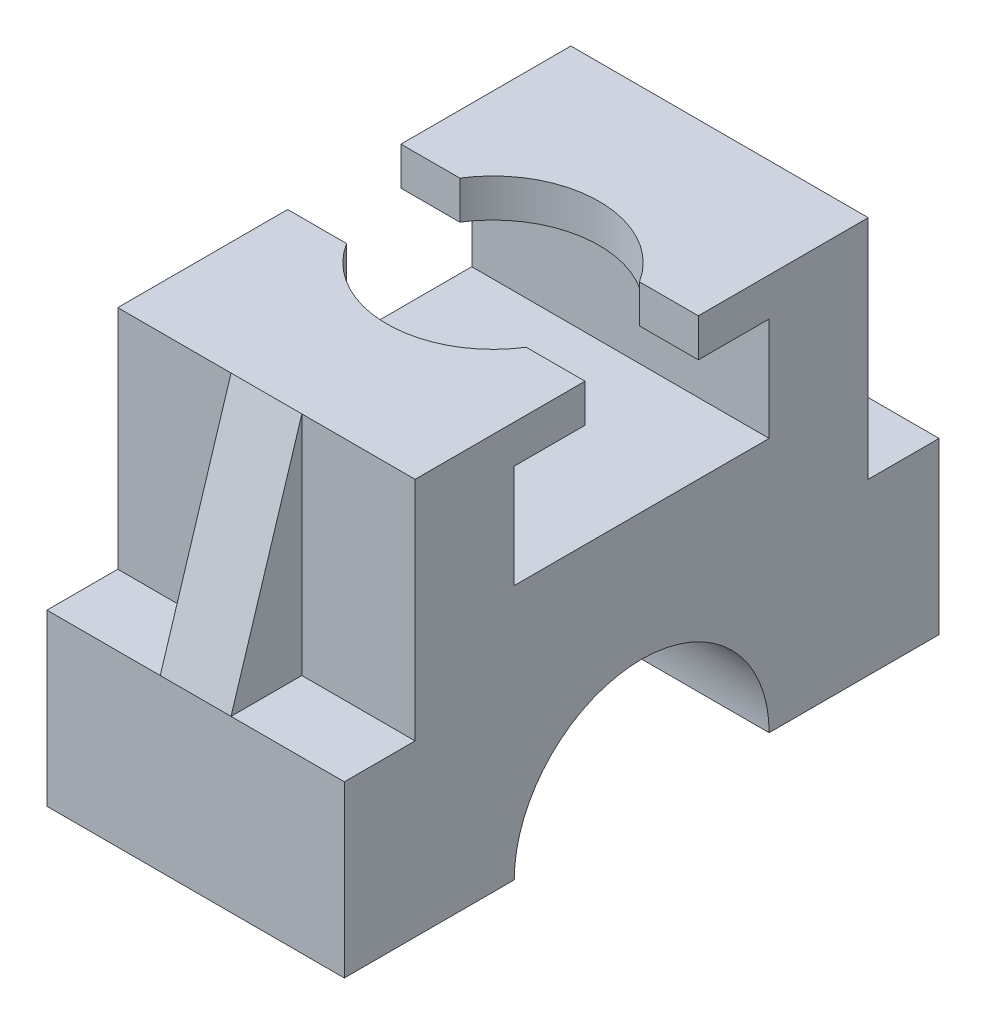
ISO-10303-21;
HEADER;
FILE_DESCRIPTION(('STEP AP214'),'2;1');
FILE_NAME('part.step','',(''),(''),'','','');
FILE_SCHEMA(('AUTOMOTIVE_DESIGN { 1 0 10303 214 1 1 1 1 }'));
ENDSEC;
DATA;
#1=APPLICATION_CONTEXT('core data for automotive mechanical design processes');
#2=APPLICATION_PROTOCOL_DEFINITION('international standard','automotive_design',2000,#1);
#3=PRODUCT_CONTEXT('',#1,'mechanical');
#4=PRODUCT('Part','Part','',(#3));
#5=PRODUCT_RELATED_PRODUCT_CATEGORY('part','',(#4));
#6=PRODUCT_DEFINITION_FORMATION('','',#4);
#7=PRODUCT_DEFINITION_CONTEXT('part definition',#1,'design');
#8=PRODUCT_DEFINITION('design','',#6,#7);
#9=PRODUCT_DEFINITION_SHAPE('','',#8);
#10=(LENGTH_UNIT() NAMED_UNIT(*) SI_UNIT(.MILLI.,.METRE.));
#11=(NAMED_UNIT(*) PLANE_ANGLE_UNIT() SI_UNIT($,.RADIAN.));
#12=(NAMED_UNIT(*) SI_UNIT($,.STERADIAN.) SOLID_ANGLE_UNIT());
#13=UNCERTAINTY_MEASURE_WITH_UNIT(LENGTH_MEASURE(1.E-05),#10,'distance_accuracy_value','');
#14=(GEOMETRIC_REPRESENTATION_CONTEXT(3) GLOBAL_UNCERTAINTY_ASSIGNED_CONTEXT((#13)) GLOBAL_UNIT_ASSIGNED_CONTEXT((#10,
#11,#12)) REPRESENTATION_CONTEXT('',''));
#15=CARTESIAN_POINT('',(0.,0.,0.));
#16=DIRECTION('',(0.,0.,1.));
#17=DIRECTION('',(1.,0.,0.));
#18=AXIS2_PLACEMENT_3D('',#15,#16,#17);
#19=CARTESIAN_POINT('',(52.5,140.,-20.));
#20=DIRECTION('',(0.,0.,-1.));
#21=DIRECTION('',(0.,1.,0.));
#22=AXIS2_PLACEMENT_3D('',#19,#20,#21);
#23=PLANE('',#22);
#24=DIRECTION('',(-1.,0.,0.));
#25=VECTOR('',#24,1.);
#26=CARTESIAN_POINT('',(52.5,126.521739130435,-20.));
#27=LINE('',#26,#25);
#28=CARTESIAN_POINT('',(-31.7214438511238,126.521739130435,-20.));
#29=VERTEX_POINT('',#28);
#30=CARTESIAN_POINT('',(-52.5,126.521739130435,-20.));
#31=VERTEX_POINT('',#30);
#32=EDGE_CURVE('E257',#29,#31,#27,.T.);
#33=ORIENTED_EDGE('',*,*,#32,.F.);
#34=DIRECTION('',(0.,1.,0.));
#35=VECTOR('',#34,1.);
#36=CARTESIAN_POINT('',(-31.7214438511238,109.,-20.));
#37=LINE('',#36,#35);
#38=CARTESIAN_POINT('',(-31.7214438511238,140.,-20.));
#39=VERTEX_POINT('',#38);
#40=EDGE_CURVE('E52',#29,#39,#37,.T.);
#41=ORIENTED_EDGE('',*,*,#40,.T.);
#42=DIRECTION('',(-1.,0.,0.));
#43=VECTOR('',#42,1.);
#44=CARTESIAN_POINT('',(52.5,140.,-20.));
#45=LINE('',#44,#43);
#46=CARTESIAN_POINT('',(-52.5,140.,-20.));
#47=VERTEX_POINT('',#46);
#48=EDGE_CURVE('E261',#39,#47,#45,.T.);
#49=ORIENTED_EDGE('',*,*,#48,.T.);
#50=DIRECTION('',(0.,-1.,0.));
#51=VECTOR('',#50,1.);
#52=CARTESIAN_POINT('',(-52.5,140.,-20.));
#53=LINE('',#52,#51);
#54=EDGE_CURVE('E323',#47,#31,#53,.T.);
#55=ORIENTED_EDGE('',*,*,#54,.T.);
#56=EDGE_LOOP('',(#33,#41,#49,#55));
#57=FACE_BOUND('',#56,.T.);
#58=ADVANCED_FACE('F37',(#57),#23,.F.);
#59=CARTESIAN_POINT('',(52.5,140.,20.));
#60=DIRECTION('',(0.,0.,1.));
#61=DIRECTION('',(0.,-1.,0.));
#62=AXIS2_PLACEMENT_3D('',#59,#60,#61);
#63=PLANE('',#62);
#64=DIRECTION('',(-1.,0.,0.));
#65=VECTOR('',#64,1.);
#66=CARTESIAN_POINT('',(52.5,126.521739130435,20.));
#67=LINE('',#66,#65);
#68=CARTESIAN_POINT('',(52.5,126.521739130435,20.));
#69=VERTEX_POINT('',#68);
#70=CARTESIAN_POINT('',(31.7214438511238,126.521739130435,20.));
#71=VERTEX_POINT('',#70);
#72=EDGE_CURVE('E236',#69,#71,#67,.T.);
#73=ORIENTED_EDGE('',*,*,#72,.T.);
#74=DIRECTION('',(0.,1.,0.));
#75=VECTOR('',#74,1.);
#76=CARTESIAN_POINT('',(31.7214438511238,109.,20.));
#77=LINE('',#76,#75);
#78=CARTESIAN_POINT('',(31.7214438511238,140.,20.));
#79=VERTEX_POINT('',#78);
#80=EDGE_CURVE('E221',#71,#79,#77,.T.);
#81=ORIENTED_EDGE('',*,*,#80,.T.);
#82=DIRECTION('',(-1.,0.,0.));
#83=VECTOR('',#82,1.);
#84=CARTESIAN_POINT('',(52.5,140.,20.));
#85=LINE('',#84,#83);
#86=CARTESIAN_POINT('',(52.5,140.,20.));
#87=VERTEX_POINT('',#86);
#88=EDGE_CURVE('E233',#87,#79,#85,.T.);
#89=ORIENTED_EDGE('',*,*,#88,.F.);
#90=DIRECTION('',(0.,1.,0.));
#91=VECTOR('',#90,1.);
#92=CARTESIAN_POINT('',(52.5,140.,20.));
#93=LINE('',#92,#91);
#94=EDGE_CURVE('E437',#69,#87,#93,.T.);
#95=ORIENTED_EDGE('',*,*,#94,.F.);
#96=EDGE_LOOP('',(#73,#81,#89,#95));
#97=FACE_BOUND('',#96,.T.);
#98=ADVANCED_FACE('F231',(#97),#63,.F.);
#99=CARTESIAN_POINT('',(52.5,60.,-105.));
#100=DIRECTION('',(0.,-1.,0.));
#101=DIRECTION('',(0.,0.,-1.));
#102=AXIS2_PLACEMENT_3D('',#99,#100,#101);
#103=PLANE('',#102);
#104=DIRECTION('',(0.,0.,1.));
#105=VECTOR('',#104,1.);
#106=CARTESIAN_POINT('',(-12.5,60.,-105.));
#107=LINE('',#106,#105);
#108=CARTESIAN_POINT('',(-12.5,60.,-105.));
#109=VERTEX_POINT('',#108);
#110=CARTESIAN_POINT('',(-12.5,60.,-80.));
#111=VERTEX_POINT('',#110);
#112=EDGE_CURVE('E506',#109,#111,#107,.T.);
#113=ORIENTED_EDGE('',*,*,#112,.F.);
#114=DIRECTION('',(-1.,0.,0.));
#115=VECTOR('',#114,1.);
#116=CARTESIAN_POINT('',(52.5,60.,-105.));
#117=LINE('',#116,#115);
#118=CARTESIAN_POINT('',(-52.5,60.,-105.));
#119=VERTEX_POINT('',#118);
#120=EDGE_CURVE('E274',#109,#119,#117,.T.);
#121=ORIENTED_EDGE('',*,*,#120,.T.);
#122=DIRECTION('',(0.,0.,1.));
#123=VECTOR('',#122,1.);
#124=CARTESIAN_POINT('',(-52.5,60.,-105.));
#125=LINE('',#124,#123);
#126=CARTESIAN_POINT('',(-52.5,60.,-80.));
#127=VERTEX_POINT('',#126);
#128=EDGE_CURVE('E314',#119,#127,#125,.T.);
#129=ORIENTED_EDGE('',*,*,#128,.T.);
#130=DIRECTION('',(-1.,0.,0.));
#131=VECTOR('',#130,1.);
#132=CARTESIAN_POINT('',(52.5,60.,-80.));
#133=LINE('',#132,#131);
#134=EDGE_CURVE('E269',#111,#127,#133,.T.);
#135=ORIENTED_EDGE('',*,*,#134,.F.);
#136=EDGE_LOOP('',(#113,#121,#129,#135));
#137=FACE_BOUND('',#136,.T.);
#138=ADVANCED_FACE('F464',(#137),#103,.F.);
#139=CARTESIAN_POINT('',(52.5,140.,-80.));
#140=DIRECTION('',(0.,0.,1.));
#141=DIRECTION('',(1.,0.,0.));
#142=AXIS2_PLACEMENT_3D('',#139,#140,#141);
#143=PLANE('',#142);
#144=DIRECTION('',(0.,1.,0.));
#145=VECTOR('',#144,1.);
#146=CARTESIAN_POINT('',(-12.5,140.,-80.));
#147=LINE('',#146,#145);
#148=CARTESIAN_POINT('',(-12.5,140.,-80.));
#149=VERTEX_POINT('',#148);
#150=EDGE_CURVE('E501',#111,#149,#147,.T.);
#151=ORIENTED_EDGE('',*,*,#150,.F.);
#152=ORIENTED_EDGE('',*,*,#134,.T.);
#153=DIRECTION('',(0.,1.,0.));
#154=VECTOR('',#153,1.);
#155=CARTESIAN_POINT('',(-52.5,140.,-80.));
#156=LINE('',#155,#154);
#157=CARTESIAN_POINT('',(-52.5,140.,-80.));
#158=VERTEX_POINT('',#157);
#159=EDGE_CURVE('E317',#127,#158,#156,.T.);
#160=ORIENTED_EDGE('',*,*,#159,.T.);
#161=DIRECTION('',(-1.,0.,0.));
#162=VECTOR('',#161,1.);
#163=CARTESIAN_POINT('',(52.5,140.,-80.));
#164=LINE('',#163,#162);
#165=EDGE_CURVE('E265',#149,#158,#164,.T.);
#166=ORIENTED_EDGE('',*,*,#165,.F.);
#167=EDGE_LOOP('',(#151,#152,#160,#166));
#168=FACE_BOUND('',#167,.T.);
#169=ADVANCED_FACE('F551',(#168),#143,.F.);
#170=CARTESIAN_POINT('',(52.5,140.,80.));
#171=DIRECTION('',(0.,0.,-1.));
#172=DIRECTION('',(-1.,0.,0.));
#173=AXIS2_PLACEMENT_3D('',#170,#171,#172);
#174=PLANE('',#173);
#175=DIRECTION('',(0.,-1.,0.));
#176=VECTOR('',#175,1.);
#177=CARTESIAN_POINT('',(-12.5,140.,80.));
#178=LINE('',#177,#176);
#179=CARTESIAN_POINT('',(-12.5,140.,80.));
#180=VERTEX_POINT('',#179);
#181=CARTESIAN_POINT('',(-12.5,60.,80.));
#182=VERTEX_POINT('',#181);
#183=EDGE_CURVE('E409',#180,#182,#178,.T.);
#184=ORIENTED_EDGE('',*,*,#183,.F.);
#185=DIRECTION('',(-1.,0.,0.));
#186=VECTOR('',#185,1.);
#187=CARTESIAN_POINT('',(52.5,140.,80.));
#188=LINE('',#187,#186);
#189=CARTESIAN_POINT('',(-52.5,140.,80.));
#190=VERTEX_POINT('',#189);
#191=EDGE_CURVE('E369',#180,#190,#188,.T.);
#192=ORIENTED_EDGE('',*,*,#191,.T.);
#193=DIRECTION('',(0.,-1.,0.));
#194=VECTOR('',#193,1.);
#195=CARTESIAN_POINT('',(-52.5,140.,80.));
#196=LINE('',#195,#194);
#197=CARTESIAN_POINT('',(-52.5,60.,80.));
#198=VERTEX_POINT('',#197);
#199=EDGE_CURVE('E347',#190,#198,#196,.T.);
#200=ORIENTED_EDGE('',*,*,#199,.T.);
#201=DIRECTION('',(-1.,0.,0.));
#202=VECTOR('',#201,1.);
#203=CARTESIAN_POINT('',(52.5,60.,80.));
#204=LINE('',#203,#202);
#205=EDGE_CURVE('E365',#182,#198,#204,.T.);
#206=ORIENTED_EDGE('',*,*,#205,.F.);
#207=EDGE_LOOP('',(#184,#192,#200,#206));
#208=FACE_BOUND('',#207,.T.);
#209=ADVANCED_FACE('F386',(#208),#174,.F.);
#210=CARTESIAN_POINT('',(52.5,60.,105.));
#211=DIRECTION('',(0.,-1.,0.));
#212=DIRECTION('',(0.,0.,-1.));
#213=AXIS2_PLACEMENT_3D('',#210,#211,#212);
#214=PLANE('',#213);
#215=DIRECTION('',(0.,0.,1.));
#216=VECTOR('',#215,1.);
#217=CARTESIAN_POINT('',(-12.5,60.,105.));
#218=LINE('',#217,#216);
#219=CARTESIAN_POINT('',(-12.5,60.,105.));
#220=VERTEX_POINT('',#219);
#221=EDGE_CURVE('E382',#182,#220,#218,.T.);
#222=ORIENTED_EDGE('',*,*,#221,.F.);
#223=ORIENTED_EDGE('',*,*,#205,.T.);
#224=DIRECTION('',(0.,0.,1.));
#225=VECTOR('',#224,1.);
#226=CARTESIAN_POINT('',(-52.5,60.,105.));
#227=LINE('',#226,#225);
#228=CARTESIAN_POINT('',(-52.5,60.,105.));
#229=VERTEX_POINT('',#228);
#230=EDGE_CURVE('E350',#198,#229,#227,.T.);
#231=ORIENTED_EDGE('',*,*,#230,.T.);
#232=DIRECTION('',(-1.,0.,0.));
#233=VECTOR('',#232,1.);
#234=CARTESIAN_POINT('',(52.5,60.,105.));
#235=LINE('',#234,#233);
#236=EDGE_CURVE('E362',#220,#229,#235,.T.);
#237=ORIENTED_EDGE('',*,*,#236,.F.);
#238=EDGE_LOOP('',(#222,#223,#231,#237));
#239=FACE_BOUND('',#238,.T.);
#240=ADVANCED_FACE('F377',(#239),#214,.F.);
#241=CARTESIAN_POINT('',(52.5,0.,0.));
#242=DIRECTION('',(-1.,0.,0.));
#243=DIRECTION('',(0.,0.,1.));
#244=AXIS2_PLACEMENT_3D('',#241,#242,#243);
#245=CYLINDRICAL_SURFACE('',#244,45.);
#246=DIRECTION('',(-1.,0.,0.));
#247=VECTOR('',#246,1.);
#248=CARTESIAN_POINT('',(52.5,0.,45.));
#249=LINE('',#248,#247);
#250=CARTESIAN_POINT('',(52.5,0.,45.));
#251=VERTEX_POINT('',#250);
#252=CARTESIAN_POINT('',(-52.5,0.,45.));
#253=VERTEX_POINT('',#252);
#254=EDGE_CURVE('E302',#251,#253,#249,.T.);
#255=ORIENTED_EDGE('',*,*,#254,.T.);
#256=CARTESIAN_POINT('',(-52.5,0.,0.));
#257=DIRECTION('',(-1.,0.,0.));
#258=DIRECTION('',(0.,0.,-1.));
#259=AXIS2_PLACEMENT_3D('',#256,#257,#258);
#260=CIRCLE('',#259,45.);
#261=CARTESIAN_POINT('',(-52.5,0.,-45.));
#262=VERTEX_POINT('',#261);
#263=EDGE_CURVE('E296',#253,#262,#260,.T.);
#264=ORIENTED_EDGE('',*,*,#263,.T.);
#265=DIRECTION('',(-1.,0.,0.));
#266=VECTOR('',#265,1.);
#267=CARTESIAN_POINT('',(52.5,0.,-45.));
#268=LINE('',#267,#266);
#269=CARTESIAN_POINT('',(52.5,0.,-45.));
#270=VERTEX_POINT('',#269);
#271=EDGE_CURVE('E45',#270,#262,#268,.T.);
#272=ORIENTED_EDGE('',*,*,#271,.F.);
#273=CARTESIAN_POINT('',(52.5,0.,0.));
#274=DIRECTION('',(-1.,0.,0.));
#275=DIRECTION('',(0.,0.,-1.));
#276=AXIS2_PLACEMENT_3D('',#273,#274,#275);
#277=CIRCLE('',#276,45.);
#278=EDGE_CURVE('E358',#251,#270,#277,.T.);
#279=ORIENTED_EDGE('',*,*,#278,.F.);
#280=EDGE_LOOP('',(#255,#264,#272,#279));
#281=FACE_BOUND('',#280,.T.);
#282=ADVANCED_FACE('F39',(#281),#245,.F.);
#283=CARTESIAN_POINT('',(52.5,0.,-45.));
#284=DIRECTION('',(0.,1.,0.));
#285=DIRECTION('',(0.,0.,1.));
#286=AXIS2_PLACEMENT_3D('',#283,#284,#285);
#287=PLANE('',#286);
#288=ORIENTED_EDGE('',*,*,#271,.T.);
#289=DIRECTION('',(0.,0.,-1.));
#290=VECTOR('',#289,1.);
#291=CARTESIAN_POINT('',(-52.5,0.,-45.));
#292=LINE('',#291,#290);
#293=CARTESIAN_POINT('',(-52.5,0.,-105.));
#294=VERTEX_POINT('',#293);
#295=EDGE_CURVE('E285',#262,#294,#292,.T.);
#296=ORIENTED_EDGE('',*,*,#295,.T.);
#297=DIRECTION('',(-1.,0.,0.));
#298=VECTOR('',#297,1.);
#299=CARTESIAN_POINT('',(52.5,0.,-105.));
#300=LINE('',#299,#298);
#301=CARTESIAN_POINT('',(52.5,0.,-105.));
#302=VERTEX_POINT('',#301);
#303=EDGE_CURVE('E278',#302,#294,#300,.T.);
#304=ORIENTED_EDGE('',*,*,#303,.F.);
#305=DIRECTION('',(0.,0.,-1.));
#306=VECTOR('',#305,1.);
#307=CARTESIAN_POINT('',(52.5,0.,-45.));
#308=LINE('',#307,#306);
#309=EDGE_CURVE('E287',#270,#302,#308,.T.);
#310=ORIENTED_EDGE('',*,*,#309,.F.);
#311=EDGE_LOOP('',(#288,#296,#304,#310));
#312=FACE_BOUND('',#311,.T.);
#313=ADVANCED_FACE('F283',(#312),#287,.F.);
#314=CARTESIAN_POINT('',(52.5,0.,-105.));
#315=DIRECTION('',(0.,0.,1.));
#316=DIRECTION('',(1.,0.,0.));
#317=AXIS2_PLACEMENT_3D('',#314,#315,#316);
#318=PLANE('',#317);
#319=ORIENTED_EDGE('',*,*,#303,.T.);
#320=DIRECTION('',(0.,1.,0.));
#321=VECTOR('',#320,1.);
#322=CARTESIAN_POINT('',(-52.5,0.,-105.));
#323=LINE('',#322,#321);
#324=EDGE_CURVE('E299',#294,#119,#323,.T.);
#325=ORIENTED_EDGE('',*,*,#324,.T.);
#326=ORIENTED_EDGE('',*,*,#120,.F.);
#327=DIRECTION('',(-1.,0.,0.));
#328=VECTOR('',#327,1.);
#329=CARTESIAN_POINT('',(52.5,60.,-105.));
#330=LINE('',#329,#328);
#331=CARTESIAN_POINT('',(12.5,60.,-105.));
#332=VERTEX_POINT('',#331);
#333=EDGE_CURVE('E514',#109,#332,#330,.F.);
#334=ORIENTED_EDGE('',*,*,#333,.T.);
#335=CARTESIAN_POINT('',(52.5,60.,-105.));
#336=VERTEX_POINT('',#335);
#337=EDGE_CURVE('E275',#336,#332,#117,.T.);
#338=ORIENTED_EDGE('',*,*,#337,.F.);
#339=DIRECTION('',(0.,1.,0.));
#340=VECTOR('',#339,1.);
#341=CARTESIAN_POINT('',(52.5,0.,-105.));
#342=LINE('',#341,#340);
#343=EDGE_CURVE('E417',#302,#336,#342,.T.);
#344=ORIENTED_EDGE('',*,*,#343,.F.);
#345=EDGE_LOOP('',(#319,#325,#326,#334,#338,#344));
#346=FACE_BOUND('',#345,.T.);
#347=ADVANCED_FACE('F557',(#346),#318,.F.);
#348=ORIENTED_EDGE('',*,*,#337,.T.);
#349=DIRECTION('',(0.,0.,1.));
#350=VECTOR('',#349,1.);
#351=CARTESIAN_POINT('',(12.5,60.,-105.));
#352=LINE('',#351,#350);
#353=CARTESIAN_POINT('',(12.5,60.,-80.));
#354=VERTEX_POINT('',#353);
#355=EDGE_CURVE('E508',#332,#354,#352,.T.);
#356=ORIENTED_EDGE('',*,*,#355,.T.);
#357=CARTESIAN_POINT('',(52.5,60.,-80.));
#358=VERTEX_POINT('',#357);
#359=EDGE_CURVE('E271',#358,#354,#133,.T.);
#360=ORIENTED_EDGE('',*,*,#359,.F.);
#361=DIRECTION('',(0.,0.,1.));
#362=VECTOR('',#361,1.);
#363=CARTESIAN_POINT('',(52.5,60.,-105.));
#364=LINE('',#363,#362);
#365=EDGE_CURVE('E419',#336,#358,#364,.T.);
#366=ORIENTED_EDGE('',*,*,#365,.F.);
#367=EDGE_LOOP('',(#348,#356,#360,#366));
#368=FACE_BOUND('',#367,.T.);
#369=ADVANCED_FACE('F565',(#368),#103,.F.);
#370=ORIENTED_EDGE('',*,*,#359,.T.);
#371=DIRECTION('',(0.,1.,0.));
#372=VECTOR('',#371,1.);
#373=CARTESIAN_POINT('',(12.5,140.,-80.));
#374=LINE('',#373,#372);
#375=CARTESIAN_POINT('',(12.5,140.,-80.));
#376=VERTEX_POINT('',#375);
#377=EDGE_CURVE('E511',#354,#376,#374,.T.);
#378=ORIENTED_EDGE('',*,*,#377,.T.);
#379=CARTESIAN_POINT('',(52.5,140.,-80.));
#380=VERTEX_POINT('',#379);
#381=EDGE_CURVE('E266',#380,#376,#164,.T.);
#382=ORIENTED_EDGE('',*,*,#381,.F.);
#383=DIRECTION('',(0.,1.,0.));
#384=VECTOR('',#383,1.);
#385=CARTESIAN_POINT('',(52.5,140.,-80.));
#386=LINE('',#385,#384);
#387=EDGE_CURVE('E421',#358,#380,#386,.T.);
#388=ORIENTED_EDGE('',*,*,#387,.F.);
#389=EDGE_LOOP('',(#370,#378,#382,#388));
#390=FACE_BOUND('',#389,.T.);
#391=ADVANCED_FACE('F480',(#390),#143,.F.);
#392=CARTESIAN_POINT('',(52.5,140.,-80.));
#393=DIRECTION('',(0.,-1.,0.));
#394=DIRECTION('',(0.,0.,-1.));
#395=AXIS2_PLACEMENT_3D('',#392,#393,#394);
#396=PLANE('',#395);
#397=ORIENTED_EDGE('',*,*,#48,.F.);
#398=CARTESIAN_POINT('',(0.,140.,0.));
#399=DIRECTION('',(0.,1.,0.));
#400=DIRECTION('',(0.,0.,1.));
#401=AXIS2_PLACEMENT_3D('',#398,#399,#400);
#402=CIRCLE('',#401,37.5);
#403=CARTESIAN_POINT('',(31.7214438511238,140.,-20.));
#404=VERTEX_POINT('',#403);
#405=EDGE_CURVE('E489',#404,#39,#402,.T.);
#406=ORIENTED_EDGE('',*,*,#405,.F.);
#407=CARTESIAN_POINT('',(52.5,140.,-20.));
#408=VERTEX_POINT('',#407);
#409=EDGE_CURVE('E262',#408,#404,#45,.T.);
#410=ORIENTED_EDGE('',*,*,#409,.F.);
#411=DIRECTION('',(0.,0.,1.));
#412=VECTOR('',#411,1.);
#413=CARTESIAN_POINT('',(52.5,140.,-80.));
#414=LINE('',#413,#412);
#415=EDGE_CURVE('E423',#380,#408,#414,.T.);
#416=ORIENTED_EDGE('',*,*,#415,.F.);
#417=ORIENTED_EDGE('',*,*,#381,.T.);
#418=EDGE_CURVE('E270',#376,#149,#164,.T.);
#419=ORIENTED_EDGE('',*,*,#418,.T.);
#420=ORIENTED_EDGE('',*,*,#165,.T.);
#421=DIRECTION('',(0.,0.,1.));
#422=VECTOR('',#421,1.);
#423=CARTESIAN_POINT('',(-52.5,140.,-80.));
#424=LINE('',#423,#422);
#425=EDGE_CURVE('E320',#158,#47,#424,.T.);
#426=ORIENTED_EDGE('',*,*,#425,.T.);
#427=EDGE_LOOP('',(#397,#406,#410,#416,#417,#419,#420,#426));
#428=FACE_BOUND('',#427,.T.);
#429=ADVANCED_FACE('F472',(#428),#396,.F.);
#430=ORIENTED_EDGE('',*,*,#409,.T.);
#431=DIRECTION('',(0.,1.,0.));
#432=VECTOR('',#431,1.);
#433=CARTESIAN_POINT('',(31.7214438511238,109.,-20.));
#434=LINE('',#433,#432);
#435=CARTESIAN_POINT('',(31.7214438511238,126.521739130435,-20.));
#436=VERTEX_POINT('',#435);
#437=EDGE_CURVE('E226',#436,#404,#434,.T.);
#438=ORIENTED_EDGE('',*,*,#437,.F.);
#439=CARTESIAN_POINT('',(52.5,126.521739130435,-20.));
#440=VERTEX_POINT('',#439);
#441=EDGE_CURVE('E258',#440,#436,#27,.T.);
#442=ORIENTED_EDGE('',*,*,#441,.F.);
#443=DIRECTION('',(0.,-1.,0.));
#444=VECTOR('',#443,1.);
#445=CARTESIAN_POINT('',(52.5,140.,-20.));
#446=LINE('',#445,#444);
#447=EDGE_CURVE('E425',#408,#440,#446,.T.);
#448=ORIENTED_EDGE('',*,*,#447,.F.);
#449=EDGE_LOOP('',(#430,#438,#442,#448));
#450=FACE_BOUND('',#449,.T.);
#451=ADVANCED_FACE('F460',(#450),#23,.F.);
#452=CARTESIAN_POINT('',(52.5,126.521739130435,-20.));
#453=DIRECTION('',(0.,1.,0.));
#454=DIRECTION('',(0.,0.,1.));
#455=AXIS2_PLACEMENT_3D('',#452,#453,#454);
#456=PLANE('',#455);
#457=ORIENTED_EDGE('',*,*,#441,.T.);
#458=CARTESIAN_POINT('',(0.,126.521739130435,0.));
#459=DIRECTION('',(0.,1.,0.));
#460=DIRECTION('',(0.,0.,1.));
#461=AXIS2_PLACEMENT_3D('',#458,#459,#460);
#462=CIRCLE('',#461,37.5);
#463=EDGE_CURVE('E11',#436,#29,#462,.T.);
#464=ORIENTED_EDGE('',*,*,#463,.T.);
#465=ORIENTED_EDGE('',*,*,#32,.T.);
#466=DIRECTION('',(0.,0.,-1.));
#467=VECTOR('',#466,1.);
#468=CARTESIAN_POINT('',(-52.5,126.521739130435,-20.));
#469=LINE('',#468,#467);
#470=CARTESIAN_POINT('',(-52.5,126.521739130435,-45.));
#471=VERTEX_POINT('',#470);
#472=EDGE_CURVE('E326',#31,#471,#469,.T.);
#473=ORIENTED_EDGE('',*,*,#472,.T.);
#474=DIRECTION('',(-1.,0.,0.));
#475=VECTOR('',#474,1.);
#476=CARTESIAN_POINT('',(52.5,126.521739130435,-45.));
#477=LINE('',#476,#475);
#478=CARTESIAN_POINT('',(52.5,126.521739130435,-45.));
#479=VERTEX_POINT('',#478);
#480=EDGE_CURVE('E255',#479,#471,#477,.T.);
#481=ORIENTED_EDGE('',*,*,#480,.F.);
#482=DIRECTION('',(0.,0.,-1.));
#483=VECTOR('',#482,1.);
#484=CARTESIAN_POINT('',(52.5,126.521739130435,-20.));
#485=LINE('',#484,#483);
#486=EDGE_CURVE('E427',#440,#479,#485,.T.);
#487=ORIENTED_EDGE('',*,*,#486,.F.);
#488=EDGE_LOOP('',(#457,#464,#465,#473,#481,#487));
#489=FACE_BOUND('',#488,.T.);
#490=ADVANCED_FACE('F471',(#489),#456,.F.);
#491=CARTESIAN_POINT('',(52.5,126.521739130435,-45.));
#492=DIRECTION('',(0.,0.,-1.));
#493=DIRECTION('',(-1.,0.,0.));
#494=AXIS2_PLACEMENT_3D('',#491,#492,#493);
#495=PLANE('',#494);
#496=ORIENTED_EDGE('',*,*,#480,.T.);
#497=DIRECTION('',(0.,-1.,0.));
#498=VECTOR('',#497,1.);
#499=CARTESIAN_POINT('',(-52.5,126.521739130435,-45.));
#500=LINE('',#499,#498);
#501=CARTESIAN_POINT('',(-52.5,90.,-45.));
#502=VERTEX_POINT('',#501);
#503=EDGE_CURVE('E329',#471,#502,#500,.T.);
#504=ORIENTED_EDGE('',*,*,#503,.T.);
#505=DIRECTION('',(-1.,0.,0.));
#506=VECTOR('',#505,1.);
#507=CARTESIAN_POINT('',(52.5,90.,-45.));
#508=LINE('',#507,#506);
#509=CARTESIAN_POINT('',(52.5,90.,-45.));
#510=VERTEX_POINT('',#509);
#511=EDGE_CURVE('E253',#510,#502,#508,.T.);
#512=ORIENTED_EDGE('',*,*,#511,.F.);
#513=DIRECTION('',(0.,-1.,0.));
#514=VECTOR('',#513,1.);
#515=CARTESIAN_POINT('',(52.5,126.521739130435,-45.));
#516=LINE('',#515,#514);
#517=EDGE_CURVE('E429',#479,#510,#516,.T.);
#518=ORIENTED_EDGE('',*,*,#517,.F.);
#519=EDGE_LOOP('',(#496,#504,#512,#518));
#520=FACE_BOUND('',#519,.T.);
#521=ADVANCED_FACE('F478',(#520),#495,.F.);
#522=CARTESIAN_POINT('',(52.5,90.,-45.));
#523=DIRECTION('',(0.,-1.,0.));
#524=DIRECTION('',(0.,0.,-1.));
#525=AXIS2_PLACEMENT_3D('',#522,#523,#524);
#526=PLANE('',#525);
#527=ORIENTED_EDGE('',*,*,#511,.T.);
#528=DIRECTION('',(0.,0.,1.));
#529=VECTOR('',#528,1.);
#530=CARTESIAN_POINT('',(-52.5,90.,-45.));
#531=LINE('',#530,#529);
#532=CARTESIAN_POINT('',(-52.5,90.,45.));
#533=VERTEX_POINT('',#532);
#534=EDGE_CURVE('E332',#502,#533,#531,.T.);
#535=ORIENTED_EDGE('',*,*,#534,.T.);
#536=DIRECTION('',(-1.,0.,0.));
#537=VECTOR('',#536,1.);
#538=CARTESIAN_POINT('',(52.5,90.,45.));
#539=LINE('',#538,#537);
#540=CARTESIAN_POINT('',(52.5,90.,45.));
#541=VERTEX_POINT('',#540);
#542=EDGE_CURVE('E251',#541,#533,#539,.T.);
#543=ORIENTED_EDGE('',*,*,#542,.F.);
#544=DIRECTION('',(0.,0.,1.));
#545=VECTOR('',#544,1.);
#546=CARTESIAN_POINT('',(52.5,90.,-45.));
#547=LINE('',#546,#545);
#548=EDGE_CURVE('E431',#510,#541,#547,.T.);
#549=ORIENTED_EDGE('',*,*,#548,.F.);
#550=EDGE_LOOP('',(#527,#535,#543,#549));
#551=FACE_BOUND('',#550,.T.);
#552=ADVANCED_FACE('F537',(#551),#526,.F.);
#553=CARTESIAN_POINT('',(52.5,126.521739130435,45.));
#554=DIRECTION('',(0.,0.,1.));
#555=DIRECTION('',(1.,0.,0.));
#556=AXIS2_PLACEMENT_3D('',#553,#554,#555);
#557=PLANE('',#556);
#558=ORIENTED_EDGE('',*,*,#542,.T.);
#559=DIRECTION('',(0.,1.,0.));
#560=VECTOR('',#559,1.);
#561=CARTESIAN_POINT('',(-52.5,126.521739130435,45.));
#562=LINE('',#561,#560);
#563=CARTESIAN_POINT('',(-52.5,126.521739130435,45.));
#564=VERTEX_POINT('',#563);
#565=EDGE_CURVE('E335',#533,#564,#562,.T.);
#566=ORIENTED_EDGE('',*,*,#565,.T.);
#567=DIRECTION('',(-1.,0.,0.));
#568=VECTOR('',#567,1.);
#569=CARTESIAN_POINT('',(52.5,126.521739130435,45.));
#570=LINE('',#569,#568);
#571=CARTESIAN_POINT('',(52.5,126.521739130435,45.));
#572=VERTEX_POINT('',#571);
#573=EDGE_CURVE('E249',#572,#564,#570,.T.);
#574=ORIENTED_EDGE('',*,*,#573,.F.);
#575=DIRECTION('',(0.,1.,0.));
#576=VECTOR('',#575,1.);
#577=CARTESIAN_POINT('',(52.5,126.521739130435,45.));
#578=LINE('',#577,#576);
#579=EDGE_CURVE('E433',#541,#572,#578,.T.);
#580=ORIENTED_EDGE('',*,*,#579,.F.);
#581=EDGE_LOOP('',(#558,#566,#574,#580));
#582=FACE_BOUND('',#581,.T.);
#583=ADVANCED_FACE('F531',(#582),#557,.F.);
#584=CARTESIAN_POINT('',(52.5,126.521739130435,20.));
#585=DIRECTION('',(0.,1.,0.));
#586=DIRECTION('',(0.,0.,1.));
#587=AXIS2_PLACEMENT_3D('',#584,#585,#586);
#588=PLANE('',#587);
#589=CARTESIAN_POINT('',(-31.7214438511238,126.521739130435,20.));
#590=VERTEX_POINT('',#589);
#591=CARTESIAN_POINT('',(-52.5,126.521739130435,20.));
#592=VERTEX_POINT('',#591);
#593=EDGE_CURVE('E241',#590,#592,#67,.T.);
#594=ORIENTED_EDGE('',*,*,#593,.F.);
#595=CARTESIAN_POINT('',(0.,126.521739130435,0.));
#596=DIRECTION('',(0.,1.,0.));
#597=DIRECTION('',(0.,0.,1.));
#598=AXIS2_PLACEMENT_3D('',#595,#596,#597);
#599=CIRCLE('',#598,37.5);
#600=EDGE_CURVE('E495',#590,#71,#599,.T.);
#601=ORIENTED_EDGE('',*,*,#600,.T.);
#602=ORIENTED_EDGE('',*,*,#72,.F.);
#603=DIRECTION('',(0.,0.,-1.));
#604=VECTOR('',#603,1.);
#605=CARTESIAN_POINT('',(52.5,126.521739130435,20.));
#606=LINE('',#605,#604);
#607=EDGE_CURVE('E435',#572,#69,#606,.T.);
#608=ORIENTED_EDGE('',*,*,#607,.F.);
#609=ORIENTED_EDGE('',*,*,#573,.T.);
#610=DIRECTION('',(0.,0.,-1.));
#611=VECTOR('',#610,1.);
#612=CARTESIAN_POINT('',(-52.5,126.521739130435,20.));
#613=LINE('',#612,#611);
#614=EDGE_CURVE('E338',#564,#592,#613,.T.);
#615=ORIENTED_EDGE('',*,*,#614,.T.);
#616=EDGE_LOOP('',(#594,#601,#602,#608,#609,#615));
#617=FACE_BOUND('',#616,.T.);
#618=ADVANCED_FACE('F526',(#617),#588,.F.);
#619=CARTESIAN_POINT('',(-31.7214438511238,140.,20.));
#620=VERTEX_POINT('',#619);
#621=CARTESIAN_POINT('',(-52.5,140.,20.));
#622=VERTEX_POINT('',#621);
#623=EDGE_CURVE('E242',#620,#622,#85,.T.);
#624=ORIENTED_EDGE('',*,*,#623,.F.);
#625=DIRECTION('',(0.,1.,0.));
#626=VECTOR('',#625,1.);
#627=CARTESIAN_POINT('',(-31.7214438511238,109.,20.));
#628=LINE('',#627,#626);
#629=EDGE_CURVE('E59',#590,#620,#628,.T.);
#630=ORIENTED_EDGE('',*,*,#629,.F.);
#631=ORIENTED_EDGE('',*,*,#593,.T.);
#632=DIRECTION('',(0.,1.,0.));
#633=VECTOR('',#632,1.);
#634=CARTESIAN_POINT('',(-52.5,140.,20.));
#635=LINE('',#634,#633);
#636=EDGE_CURVE('E341',#592,#622,#635,.T.);
#637=ORIENTED_EDGE('',*,*,#636,.T.);
#638=EDGE_LOOP('',(#624,#630,#631,#637));
#639=FACE_BOUND('',#638,.T.);
#640=ADVANCED_FACE('F466',(#639),#63,.F.);
#641=CARTESIAN_POINT('',(52.5,140.,80.));
#642=DIRECTION('',(0.,-1.,0.));
#643=DIRECTION('',(0.,0.,-1.));
#644=AXIS2_PLACEMENT_3D('',#641,#642,#643);
#645=PLANE('',#644);
#646=ORIENTED_EDGE('',*,*,#88,.T.);
#647=CARTESIAN_POINT('',(0.,140.,0.));
#648=DIRECTION('',(0.,1.,0.));
#649=DIRECTION('',(0.,0.,1.));
#650=AXIS2_PLACEMENT_3D('',#647,#648,#649);
#651=CIRCLE('',#650,37.5);
#652=EDGE_CURVE('E218',#620,#79,#651,.T.);
#653=ORIENTED_EDGE('',*,*,#652,.F.);
#654=ORIENTED_EDGE('',*,*,#623,.T.);
#655=DIRECTION('',(0.,0.,1.));
#656=VECTOR('',#655,1.);
#657=CARTESIAN_POINT('',(-52.5,140.,80.));
#658=LINE('',#657,#656);
#659=EDGE_CURVE('E344',#622,#190,#658,.T.);
#660=ORIENTED_EDGE('',*,*,#659,.T.);
#661=ORIENTED_EDGE('',*,*,#191,.F.);
#662=DIRECTION('',(1.,0.,0.));
#663=VECTOR('',#662,1.);
#664=CARTESIAN_POINT('',(52.5,140.,80.));
#665=LINE('',#664,#663);
#666=CARTESIAN_POINT('',(12.5,140.,80.));
#667=VERTEX_POINT('',#666);
#668=EDGE_CURVE('E304',#180,#667,#665,.T.);
#669=ORIENTED_EDGE('',*,*,#668,.T.);
#670=CARTESIAN_POINT('',(52.5,140.,80.));
#671=VERTEX_POINT('',#670);
#672=EDGE_CURVE('E245',#671,#667,#188,.T.);
#673=ORIENTED_EDGE('',*,*,#672,.F.);
#674=DIRECTION('',(0.,0.,1.));
#675=VECTOR('',#674,1.);
#676=CARTESIAN_POINT('',(52.5,140.,80.));
#677=LINE('',#676,#675);
#678=EDGE_CURVE('E240',#87,#671,#677,.T.);
#679=ORIENTED_EDGE('',*,*,#678,.F.);
#680=EDGE_LOOP('',(#646,#653,#654,#660,#661,#669,#673,#679));
#681=FACE_BOUND('',#680,.T.);
#682=ADVANCED_FACE('F238',(#681),#645,.F.);
#683=ORIENTED_EDGE('',*,*,#672,.T.);
#684=DIRECTION('',(0.,-1.,0.));
#685=VECTOR('',#684,1.);
#686=CARTESIAN_POINT('',(12.5,140.,80.));
#687=LINE('',#686,#685);
#688=CARTESIAN_POINT('',(12.5,60.,80.));
#689=VERTEX_POINT('',#688);
#690=EDGE_CURVE('E307',#667,#689,#687,.T.);
#691=ORIENTED_EDGE('',*,*,#690,.T.);
#692=CARTESIAN_POINT('',(52.5,60.,80.));
#693=VERTEX_POINT('',#692);
#694=EDGE_CURVE('E367',#693,#689,#204,.T.);
#695=ORIENTED_EDGE('',*,*,#694,.F.);
#696=DIRECTION('',(0.,-1.,0.));
#697=VECTOR('',#696,1.);
#698=CARTESIAN_POINT('',(52.5,140.,80.));
#699=LINE('',#698,#697);
#700=EDGE_CURVE('E440',#671,#693,#699,.T.);
#701=ORIENTED_EDGE('',*,*,#700,.F.);
#702=EDGE_LOOP('',(#683,#691,#695,#701));
#703=FACE_BOUND('',#702,.T.);
#704=ADVANCED_FACE('F682',(#703),#174,.F.);
#705=ORIENTED_EDGE('',*,*,#694,.T.);
#706=DIRECTION('',(0.,0.,1.));
#707=VECTOR('',#706,1.);
#708=CARTESIAN_POINT('',(12.5,60.,105.));
#709=LINE('',#708,#707);
#710=CARTESIAN_POINT('',(12.5,59.9999999999999,105.));
#711=VERTEX_POINT('',#710);
#712=EDGE_CURVE('E405',#689,#711,#709,.T.);
#713=ORIENTED_EDGE('',*,*,#712,.T.);
#714=CARTESIAN_POINT('',(52.5,60.,105.));
#715=VERTEX_POINT('',#714);
#716=EDGE_CURVE('E363',#715,#711,#235,.T.);
#717=ORIENTED_EDGE('',*,*,#716,.F.);
#718=DIRECTION('',(0.,0.,1.));
#719=VECTOR('',#718,1.);
#720=CARTESIAN_POINT('',(52.5,60.,105.));
#721=LINE('',#720,#719);
#722=EDGE_CURVE('E442',#693,#715,#721,.T.);
#723=ORIENTED_EDGE('',*,*,#722,.F.);
#724=EDGE_LOOP('',(#705,#713,#717,#723));
#725=FACE_BOUND('',#724,.T.);
#726=ADVANCED_FACE('F408',(#725),#214,.F.);
#727=CARTESIAN_POINT('',(52.5,0.,105.));
#728=DIRECTION('',(0.,0.,-1.));
#729=DIRECTION('',(-1.,0.,0.));
#730=AXIS2_PLACEMENT_3D('',#727,#728,#729);
#731=PLANE('',#730);
#732=ORIENTED_EDGE('',*,*,#716,.T.);
#733=EDGE_CURVE('E366',#711,#220,#235,.T.);
#734=ORIENTED_EDGE('',*,*,#733,.T.);
#735=ORIENTED_EDGE('',*,*,#236,.T.);
#736=DIRECTION('',(0.,-1.,0.));
#737=VECTOR('',#736,1.);
#738=CARTESIAN_POINT('',(-52.5,0.,105.));
#739=LINE('',#738,#737);
#740=CARTESIAN_POINT('',(-52.5,0.,105.));
#741=VERTEX_POINT('',#740);
#742=EDGE_CURVE('E353',#229,#741,#739,.T.);
#743=ORIENTED_EDGE('',*,*,#742,.T.);
#744=DIRECTION('',(-1.,0.,0.));
#745=VECTOR('',#744,1.);
#746=CARTESIAN_POINT('',(52.5,0.,105.));
#747=LINE('',#746,#745);
#748=CARTESIAN_POINT('',(52.5,0.,105.));
#749=VERTEX_POINT('',#748);
#750=EDGE_CURVE('E360',#749,#741,#747,.T.);
#751=ORIENTED_EDGE('',*,*,#750,.F.);
#752=DIRECTION('',(0.,-1.,0.));
#753=VECTOR('',#752,1.);
#754=CARTESIAN_POINT('',(52.5,0.,105.));
#755=LINE('',#754,#753);
#756=EDGE_CURVE('E443',#715,#749,#755,.T.);
#757=ORIENTED_EDGE('',*,*,#756,.F.);
#758=EDGE_LOOP('',(#732,#734,#735,#743,#751,#757));
#759=FACE_BOUND('',#758,.T.);
#760=ADVANCED_FACE('F391',(#759),#731,.F.);
#761=CARTESIAN_POINT('',(52.5,0.,45.));
#762=DIRECTION('',(0.,1.,0.));
#763=DIRECTION('',(0.,0.,1.));
#764=AXIS2_PLACEMENT_3D('',#761,#762,#763);
#765=PLANE('',#764);
#766=ORIENTED_EDGE('',*,*,#750,.T.);
#767=DIRECTION('',(0.,0.,-1.));
#768=VECTOR('',#767,1.);
#769=CARTESIAN_POINT('',(-52.5,0.,45.));
#770=LINE('',#769,#768);
#771=EDGE_CURVE('E356',#741,#253,#770,.T.);
#772=ORIENTED_EDGE('',*,*,#771,.T.);
#773=ORIENTED_EDGE('',*,*,#254,.F.);
#774=DIRECTION('',(0.,0.,-1.));
#775=VECTOR('',#774,1.);
#776=CARTESIAN_POINT('',(52.5,0.,45.));
#777=LINE('',#776,#775);
#778=EDGE_CURVE('E310',#749,#251,#777,.T.);
#779=ORIENTED_EDGE('',*,*,#778,.F.);
#780=EDGE_LOOP('',(#766,#772,#773,#779));
#781=FACE_BOUND('',#780,.T.);
#782=ADVANCED_FACE('F447',(#781),#765,.F.);
#783=CARTESIAN_POINT('',(52.5,0.,0.));
#784=DIRECTION('',(1.,0.,0.));
#785=DIRECTION('',(0.,0.,-1.));
#786=AXIS2_PLACEMENT_3D('',#783,#784,#785);
#787=PLANE('',#786);
#788=ORIENTED_EDGE('',*,*,#278,.T.);
#789=ORIENTED_EDGE('',*,*,#309,.T.);
#790=ORIENTED_EDGE('',*,*,#343,.T.);
#791=ORIENTED_EDGE('',*,*,#365,.T.);
#792=ORIENTED_EDGE('',*,*,#387,.T.);
#793=ORIENTED_EDGE('',*,*,#415,.T.);
#794=ORIENTED_EDGE('',*,*,#447,.T.);
#795=ORIENTED_EDGE('',*,*,#486,.T.);
#796=ORIENTED_EDGE('',*,*,#517,.T.);
#797=ORIENTED_EDGE('',*,*,#548,.T.);
#798=ORIENTED_EDGE('',*,*,#579,.T.);
#799=ORIENTED_EDGE('',*,*,#607,.T.);
#800=ORIENTED_EDGE('',*,*,#94,.T.);
#801=ORIENTED_EDGE('',*,*,#678,.T.);
#802=ORIENTED_EDGE('',*,*,#700,.T.);
#803=ORIENTED_EDGE('',*,*,#722,.T.);
#804=ORIENTED_EDGE('',*,*,#756,.T.);
#805=ORIENTED_EDGE('',*,*,#778,.T.);
#806=EDGE_LOOP('',(#788,#789,#790,#791,#792,#793,#794,#795,#796,#797,#798,#799,#800,#801,#802,
#803,#804,#805));
#807=FACE_BOUND('',#806,.T.);
#808=ADVANCED_FACE('F445',(#807),#787,.T.);
#809=CARTESIAN_POINT('',(-52.5,0.,0.));
#810=DIRECTION('',(1.,0.,0.));
#811=DIRECTION('',(0.,0.,-1.));
#812=AXIS2_PLACEMENT_3D('',#809,#810,#811);
#813=PLANE('',#812);
#814=ORIENTED_EDGE('',*,*,#263,.F.);
#815=ORIENTED_EDGE('',*,*,#771,.F.);
#816=ORIENTED_EDGE('',*,*,#742,.F.);
#817=ORIENTED_EDGE('',*,*,#230,.F.);
#818=ORIENTED_EDGE('',*,*,#199,.F.);
#819=ORIENTED_EDGE('',*,*,#659,.F.);
#820=ORIENTED_EDGE('',*,*,#636,.F.);
#821=ORIENTED_EDGE('',*,*,#614,.F.);
#822=ORIENTED_EDGE('',*,*,#565,.F.);
#823=ORIENTED_EDGE('',*,*,#534,.F.);
#824=ORIENTED_EDGE('',*,*,#503,.F.);
#825=ORIENTED_EDGE('',*,*,#472,.F.);
#826=ORIENTED_EDGE('',*,*,#54,.F.);
#827=ORIENTED_EDGE('',*,*,#425,.F.);
#828=ORIENTED_EDGE('',*,*,#159,.F.);
#829=ORIENTED_EDGE('',*,*,#128,.F.);
#830=ORIENTED_EDGE('',*,*,#324,.F.);
#831=ORIENTED_EDGE('',*,*,#295,.F.);
#832=EDGE_LOOP('',(#814,#815,#816,#817,#818,#819,#820,#821,#822,#823,#824,#825,#826,#827,#828,
#829,#830,#831));
#833=FACE_BOUND('',#832,.T.);
#834=ADVANCED_FACE('F294',(#833),#813,.F.);
#835=CARTESIAN_POINT('',(0.,140.,80.));
#836=DIRECTION('',(0.,0.298274993135947,0.95447997803503));
#837=DIRECTION('',(0.,-0.95447997803503,0.298274993135947));
#838=AXIS2_PLACEMENT_3D('',#835,#836,#837);
#839=PLANE('',#838);
#840=ORIENTED_EDGE('',*,*,#668,.F.);
#841=DIRECTION('',(0.,-0.95447997803503,0.298274993135947));
#842=VECTOR('',#841,1.);
#843=CARTESIAN_POINT('',(-12.5,140.,80.));
#844=LINE('',#843,#842);
#845=EDGE_CURVE('E402',#180,#220,#844,.T.);
#846=ORIENTED_EDGE('',*,*,#845,.T.);
#847=ORIENTED_EDGE('',*,*,#733,.F.);
#848=DIRECTION('',(0.,-0.95447997803503,0.298274993135947));
#849=VECTOR('',#848,1.);
#850=CARTESIAN_POINT('',(12.5,140.,80.));
#851=LINE('',#850,#849);
#852=EDGE_CURVE('E400',#667,#711,#851,.T.);
#853=ORIENTED_EDGE('',*,*,#852,.F.);
#854=EDGE_LOOP('',(#840,#846,#847,#853));
#855=FACE_BOUND('',#854,.T.);
#856=ADVANCED_FACE('F399',(#855),#839,.T.);
#857=CARTESIAN_POINT('',(12.5,70.,0.));
#858=DIRECTION('',(1.,0.,0.));
#859=DIRECTION('',(0.,0.,-1.));
#860=AXIS2_PLACEMENT_3D('',#857,#858,#859);
#861=PLANE('',#860);
#862=ORIENTED_EDGE('',*,*,#690,.F.);
#863=ORIENTED_EDGE('',*,*,#852,.T.);
#864=ORIENTED_EDGE('',*,*,#712,.F.);
#865=EDGE_LOOP('',(#862,#863,#864));
#866=FACE_BOUND('',#865,.T.);
#867=ADVANCED_FACE('F404',(#866),#861,.T.);
#868=CARTESIAN_POINT('',(-12.5,70.,0.));
#869=DIRECTION('',(1.,0.,0.));
#870=DIRECTION('',(0.,0.,-1.));
#871=AXIS2_PLACEMENT_3D('',#868,#869,#870);
#872=PLANE('',#871);
#873=ORIENTED_EDGE('',*,*,#845,.F.);
#874=ORIENTED_EDGE('',*,*,#183,.T.);
#875=ORIENTED_EDGE('',*,*,#221,.T.);
#876=EDGE_LOOP('',(#873,#874,#875));
#877=FACE_BOUND('',#876,.T.);
#878=ADVANCED_FACE('F518',(#877),#872,.F.);
#879=CARTESIAN_POINT('',(0.,140.,-80.));
#880=DIRECTION('',(0.,-0.298274993135947,0.95447997803503));
#881=DIRECTION('',(0.,-0.95447997803503,-0.298274993135947));
#882=AXIS2_PLACEMENT_3D('',#879,#880,#881);
#883=PLANE('',#882);
#884=ORIENTED_EDGE('',*,*,#333,.F.);
#885=DIRECTION('',(0.,-0.95447997803503,-0.298274993135947));
#886=VECTOR('',#885,1.);
#887=CARTESIAN_POINT('',(-12.5,140.,-80.));
#888=LINE('',#887,#886);
#889=EDGE_CURVE('E497',#149,#109,#888,.T.);
#890=ORIENTED_EDGE('',*,*,#889,.F.);
#891=ORIENTED_EDGE('',*,*,#418,.F.);
#892=DIRECTION('',(0.,-0.95447997803503,-0.298274993135947));
#893=VECTOR('',#892,1.);
#894=CARTESIAN_POINT('',(12.5,140.,-80.));
#895=LINE('',#894,#893);
#896=EDGE_CURVE('E498',#376,#332,#895,.T.);
#897=ORIENTED_EDGE('',*,*,#896,.T.);
#898=EDGE_LOOP('',(#884,#890,#891,#897));
#899=FACE_BOUND('',#898,.T.);
#900=ADVANCED_FACE('F571',(#899),#883,.F.);
#901=CARTESIAN_POINT('',(12.5,70.,0.));
#902=DIRECTION('',(1.,0.,0.));
#903=DIRECTION('',(0.,0.,-1.));
#904=AXIS2_PLACEMENT_3D('',#901,#902,#903);
#905=PLANE('',#904);
#906=ORIENTED_EDGE('',*,*,#377,.F.);
#907=ORIENTED_EDGE('',*,*,#355,.F.);
#908=ORIENTED_EDGE('',*,*,#896,.F.);
#909=EDGE_LOOP('',(#906,#907,#908));
#910=FACE_BOUND('',#909,.T.);
#911=ADVANCED_FACE('F569',(#910),#905,.T.);
#912=CARTESIAN_POINT('',(-12.5,70.,0.));
#913=DIRECTION('',(1.,0.,0.));
#914=DIRECTION('',(0.,0.,-1.));
#915=AXIS2_PLACEMENT_3D('',#912,#913,#914);
#916=PLANE('',#915);
#917=ORIENTED_EDGE('',*,*,#889,.T.);
#918=ORIENTED_EDGE('',*,*,#112,.T.);
#919=ORIENTED_EDGE('',*,*,#150,.T.);
#920=EDGE_LOOP('',(#917,#918,#919));
#921=FACE_BOUND('',#920,.T.);
#922=ADVANCED_FACE('F573',(#921),#916,.F.);
#923=CARTESIAN_POINT('',(0.,109.,0.));
#924=DIRECTION('',(0.,1.,0.));
#925=DIRECTION('',(0.,0.,1.));
#926=AXIS2_PLACEMENT_3D('',#923,#924,#925);
#927=CYLINDRICAL_SURFACE('',#926,37.5);
#928=ORIENTED_EDGE('',*,*,#629,.T.);
#929=ORIENTED_EDGE('',*,*,#652,.T.);
#930=ORIENTED_EDGE('',*,*,#80,.F.);
#931=ORIENTED_EDGE('',*,*,#600,.F.);
#932=EDGE_LOOP('',(#928,#929,#930,#931));
#933=FACE_BOUND('',#932,.T.);
#934=ADVANCED_FACE('F220',(#933),#927,.F.);
#935=CARTESIAN_POINT('',(0.,109.,0.));
#936=DIRECTION('',(0.,1.,0.));
#937=DIRECTION('',(0.,0.,1.));
#938=AXIS2_PLACEMENT_3D('',#935,#936,#937);
#939=CYLINDRICAL_SURFACE('',#938,37.5);
#940=ORIENTED_EDGE('',*,*,#437,.T.);
#941=ORIENTED_EDGE('',*,*,#405,.T.);
#942=ORIENTED_EDGE('',*,*,#40,.F.);
#943=ORIENTED_EDGE('',*,*,#463,.F.);
#944=EDGE_LOOP('',(#940,#941,#942,#943));
#945=FACE_BOUND('',#944,.T.);
#946=ADVANCED_FACE('F580',(#945),#939,.F.);
#947=CLOSED_SHELL('',(#58,#98,#138,#169,#209,#240,#282,#313,#347,#369,#391,#429,#451,#490,#521,
#552,#583,#618,#640,#682,#704,#726,#760,#782,#808,#834,#856,#867,#878,#900,#911,#922,#934,#946));
#948=MANIFOLD_SOLID_BREP('B2',#947);
#949=ADVANCED_BREP_SHAPE_REPRESENTATION('',(#18,#948),#14);
#950=SHAPE_DEFINITION_REPRESENTATION(#9,#949);
ENDSEC;
END-ISO-10303-21;
